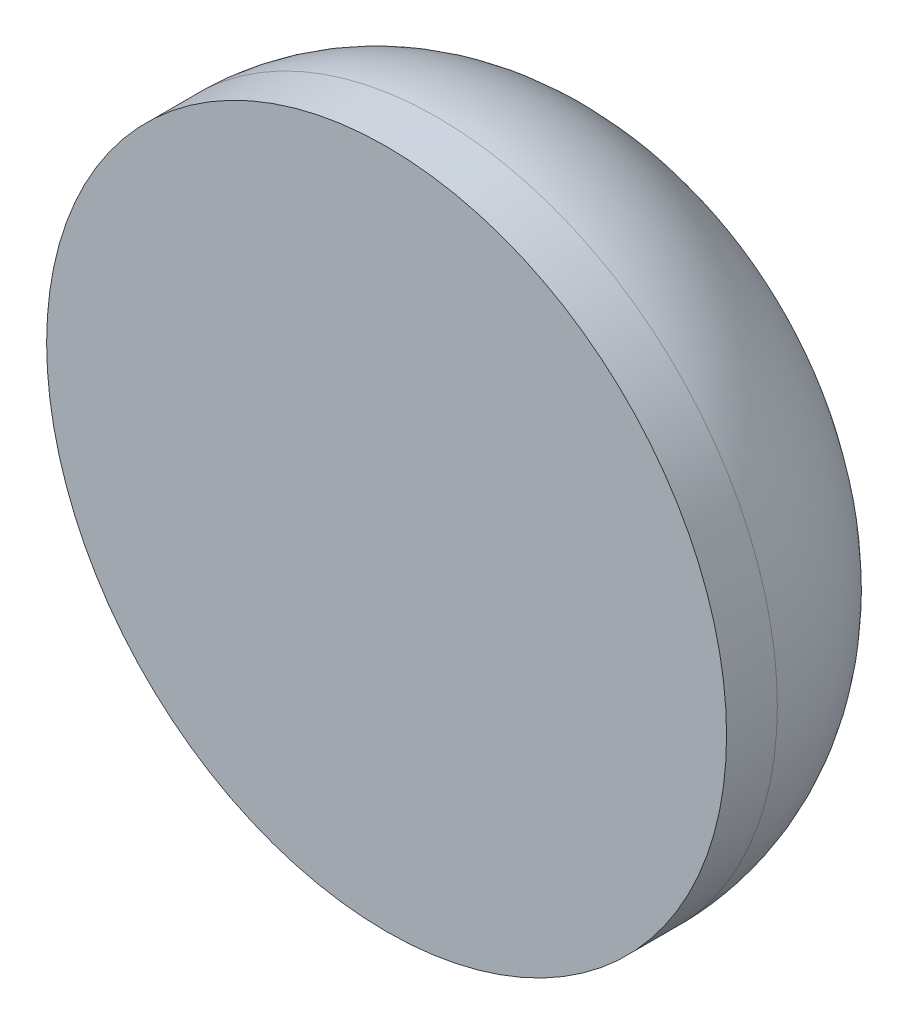
ISO-10303-21;
HEADER;
FILE_DESCRIPTION(('STEP AP214'),'2;1');
FILE_NAME('part.step','',(''),(''),'','','');
FILE_SCHEMA(('AUTOMOTIVE_DESIGN { 1 0 10303 214 1 1 1 1 }'));
ENDSEC;
DATA;
#1=APPLICATION_CONTEXT('core data for automotive mechanical design processes');
#2=APPLICATION_PROTOCOL_DEFINITION('international standard','automotive_design',2000,#1);
#3=PRODUCT_CONTEXT('',#1,'mechanical');
#4=PRODUCT('Part','Part','',(#3));
#5=PRODUCT_RELATED_PRODUCT_CATEGORY('part','',(#4));
#6=PRODUCT_DEFINITION_FORMATION('','',#4);
#7=PRODUCT_DEFINITION_CONTEXT('part definition',#1,'design');
#8=PRODUCT_DEFINITION('design','',#6,#7);
#9=PRODUCT_DEFINITION_SHAPE('','',#8);
#10=(LENGTH_UNIT() NAMED_UNIT(*) SI_UNIT(.MILLI.,.METRE.));
#11=(NAMED_UNIT(*) PLANE_ANGLE_UNIT() SI_UNIT($,.RADIAN.));
#12=(NAMED_UNIT(*) SI_UNIT($,.STERADIAN.) SOLID_ANGLE_UNIT());
#13=UNCERTAINTY_MEASURE_WITH_UNIT(LENGTH_MEASURE(1.E-05),#10,'distance_accuracy_value','');
#14=(GEOMETRIC_REPRESENTATION_CONTEXT(3) GLOBAL_UNCERTAINTY_ASSIGNED_CONTEXT((#13)) GLOBAL_UNIT_ASSIGNED_CONTEXT((#10,
#11,#12)) REPRESENTATION_CONTEXT('',''));
#15=CARTESIAN_POINT('',(0.,0.,0.));
#16=DIRECTION('',(0.,0.,1.));
#17=DIRECTION('',(1.,0.,0.));
#18=AXIS2_PLACEMENT_3D('',#15,#16,#17);
#19=CARTESIAN_POINT('',(199.5,42.5,-0.49999999999999));
#20=DIRECTION('',(0.,0.,1.));
#21=DIRECTION('',(1.,0.,0.));
#22=AXIS2_PLACEMENT_3D('',#19,#20,#21);
#23=DEGENERATE_TOROIDAL_SURFACE('',#22,1.35,2.,.T.);
#24=CARTESIAN_POINT('',(199.5,42.5,-0.49999999999999));
#25=DIRECTION('',(0.,0.,-1.));
#26=DIRECTION('',(1.,0.,0.));
#27=AXIS2_PLACEMENT_3D('',#24,#25,#26);
#28=CIRCLE('',#27,3.35);
#29=CARTESIAN_POINT('',(202.85,42.5,-0.49999999999999));
#30=VERTEX_POINT('',#29);
#31=EDGE_CURVE('E468',#30,#30,#28,.T.);
#32=ORIENTED_EDGE('',*,*,#31,.T.);
#33=EDGE_LOOP('',(#32));
#34=FACE_BOUND('',#33,.T.);
#35=CARTESIAN_POINT('',(200.175,41.330865704891,-2.49999999999999));
#36=DIRECTION('',(-0.884592557213002,-0.466364672464973,0.));
#37=VECTOR('',#36,1.);
#38=LINE('',#35,#37);
#39=CARTESIAN_POINT('',(200.175,41.330865704891,-2.5));
#40=VERTEX_POINT('',#39);
#41=CARTESIAN_POINT('',(200.083255290539,41.2824971186653,-2.5));
#42=VERTEX_POINT('',#41);
#43=EDGE_CURVE('E504',#40,#42,#38,.T.);
#44=ORIENTED_EDGE('',*,*,#43,.F.);
#45=CARTESIAN_POINT('',(200.262760779147,41.386134660834,-2.49999999999999));
#46=DIRECTION('',(-0.846179932388777,-0.532897290312612,0.));
#47=VECTOR('',#46,1.);
#48=LINE('',#45,#47);
#49=CARTESIAN_POINT('',(200.262760779147,41.3861346608342,-2.5));
#50=VERTEX_POINT('',#49);
#51=EDGE_CURVE('E503',#50,#40,#48,.T.);
#52=ORIENTED_EDGE('',*,*,#51,.F.);
#53=CARTESIAN_POINT('',(200.820888740771,41.7376259536584,-2.49231935264969));
#54=CARTESIAN_POINT('',(200.76707267624,41.7037343026438,-2.49491016210421));
#55=CARTESIAN_POINT('',(200.713237606234,41.6698306825838,-2.49659046781528));
#56=CARTESIAN_POINT('',(200.605554180877,41.6020150757748,-2.49880179554116));
#57=CARTESIAN_POINT('',(200.551705827366,41.5681030901846,-2.49933293118034));
#58=CARTESIAN_POINT('',(200.444017101078,41.5002841450182,-2.49991785013854));
#59=CARTESIAN_POINT('',(200.390176728197,41.4663771853756,-2.49997169719303));
#60=CARTESIAN_POINT('',(200.309413538374,41.4155150893058,-2.5000000783496));
#61=CARTESIAN_POINT('',(200.282490893817,41.3985600614404,-2.50000080608306));
#62=CARTESIAN_POINT('',(200.228645480391,41.3646499274227,-2.49999914897867));
#63=CARTESIAN_POINT('',(200.201722711523,41.3476948212705,-2.49999676412646));
#64=CARTESIAN_POINT('',(200.1748,41.3307397512327,-2.49999999997929));
#65=B_SPLINE_CURVE_WITH_KNOTS('',3,(#53,#54,#55,#56,#57,#58,#59,#60,#61,#62,#63,#64),
.UNSPECIFIED.,.F.,.F.,(4,2,2,2,2,4),(0.,0.190928170324365,0.381837461734963,0.57272125939935,
0.668171261887219,0.763621704639109),.UNSPECIFIED.);
#66=CARTESIAN_POINT('',(200.820688740771,41.7374999999995,-2.49232903908965));
#67=VERTEX_POINT('',#66);
#68=EDGE_CURVE('E450',#67,#50,#65,.T.);
#69=ORIENTED_EDGE('',*,*,#68,.F.);
#70=CARTESIAN_POINT('',(200.850007688199,42.5002,-2.49999999998515));
#71=CARTESIAN_POINT('',(200.84878563852,42.4684097287936,-2.49999676449696));
#72=CARTESIAN_POINT('',(200.847563586239,42.4366193899036,-2.49999914972349));
#73=CARTESIAN_POINT('',(200.845119487317,42.3730388588224,-2.50000080559944));
#74=CARTESIAN_POINT('',(200.843897440675,42.3412486666312,-2.50000007626321));
#75=CARTESIAN_POINT('',(200.840231516028,42.245883690263,-2.49997168433805));
#76=CARTESIAN_POINT('',(200.837787645843,42.1823091095479,-2.49991782215721));
#77=CARTESIAN_POINT('',(200.832899543358,42.0551505280727,-2.49933295920848));
#78=CARTESIAN_POINT('',(200.830455311053,41.991566527188,-2.49880189473561));
#79=CARTESIAN_POINT('',(200.825567449153,41.8644142042727,-2.49659099524004));
#80=CARTESIAN_POINT('',(200.823123819642,41.8008458844134,-2.49491104665122));
#81=CARTESIAN_POINT('',(200.820681052572,41.7373,-2.49232083712689));
#82=B_SPLINE_CURVE_WITH_KNOTS('',3,(#70,#71,#72,#73,#74,#75,#76,#77,#78,#79,#80,#81),
.UNSPECIFIED.,.F.,.F.,(4,2,2,2,2,4),(0.,0.0954413882068687,0.190882336452529,0.381748030871387,
0.572639209039685,0.763549259349352),.UNSPECIFIED.);
#83=CARTESIAN_POINT('',(200.846016069686,42.3963624578316,-2.5));
#84=VERTEX_POINT('',#83);
#85=EDGE_CURVE('E163',#84,#67,#82,.T.);
#86=ORIENTED_EDGE('',*,*,#85,.F.);
#87=CARTESIAN_POINT('',(200.85,42.5,-2.49999999999999));
#88=DIRECTION('',(-0.0384126248240564,-0.999261962777592,0.));
#89=VECTOR('',#88,1.);
#90=LINE('',#87,#89);
#91=CARTESIAN_POINT('',(200.85,42.5,-2.5));
#92=VERTEX_POINT('',#91);
#93=EDGE_CURVE('E159',#92,#84,#90,.T.);
#94=ORIENTED_EDGE('',*,*,#93,.F.);
#95=CARTESIAN_POINT('',(200.846016069686,42.6036375421684,-2.49999999999999));
#96=DIRECTION('',(0.0384126248243134,-0.999261962777582,0.));
#97=VECTOR('',#96,1.);
#98=LINE('',#95,#97);
#99=CARTESIAN_POINT('',(200.846016069686,42.6036375421685,-2.5));
#100=VERTEX_POINT('',#99);
#101=EDGE_CURVE('E457',#100,#92,#98,.T.);
#102=ORIENTED_EDGE('',*,*,#101,.F.);
#103=CARTESIAN_POINT('',(200.820681052572,43.2627,-2.49232083712688));
#104=CARTESIAN_POINT('',(200.823123819642,43.1991541155866,-2.49491104665121));
#105=CARTESIAN_POINT('',(200.825567449153,43.1355857957273,-2.49659099524003));
#106=CARTESIAN_POINT('',(200.830455311053,43.008433472812,-2.4988018947356));
#107=CARTESIAN_POINT('',(200.832899543358,42.9448494719273,-2.49933295920848));
#108=CARTESIAN_POINT('',(200.837787645843,42.8176908904521,-2.4999178221572));
#109=CARTESIAN_POINT('',(200.840231516028,42.754116309737,-2.49997168433805));
#110=CARTESIAN_POINT('',(200.843897440675,42.6587513333688,-2.50000007626321));
#111=CARTESIAN_POINT('',(200.845119487317,42.6269611411776,-2.50000080559944));
#112=CARTESIAN_POINT('',(200.847563586239,42.5633806100964,-2.49999914972349));
#113=CARTESIAN_POINT('',(200.84878563852,42.5315902712064,-2.49999676449696));
#114=CARTESIAN_POINT('',(200.850007688199,42.4998,-2.49999999998515));
#115=B_SPLINE_CURVE_WITH_KNOTS('',3,(#103,#104,#105,#106,#107,#108,#109,#110,#111,#112,#113,
#114),.UNSPECIFIED.,.F.,.F.,(4,2,2,2,2,4),(0.,0.19091005030967,0.381801228477975,
0.572666922896826,0.668107871142479,0.763549259349352),.UNSPECIFIED.);
#116=CARTESIAN_POINT('',(200.820688740771,43.2625,-2.49232903908966));
#117=VERTEX_POINT('',#116);
#118=EDGE_CURVE('E411',#117,#100,#115,.T.);
#119=ORIENTED_EDGE('',*,*,#118,.F.);
#120=CARTESIAN_POINT('',(200.1748,43.6692602487673,-2.49999999997929));
#121=CARTESIAN_POINT('',(200.201722711523,43.6523051787294,-2.49999676412646));
#122=CARTESIAN_POINT('',(200.228645480391,43.6353500725771,-2.49999914897867));
#123=CARTESIAN_POINT('',(200.282490893817,43.6014399385595,-2.50000080608306));
#124=CARTESIAN_POINT('',(200.309413538374,43.5844849106941,-2.5000000783496));
#125=CARTESIAN_POINT('',(200.390176728197,43.5336228146243,-2.49997169719303));
#126=CARTESIAN_POINT('',(200.444017101078,43.4997158549817,-2.49991785013854));
#127=CARTESIAN_POINT('',(200.551705827365,43.4318969098153,-2.49933293118034));
#128=CARTESIAN_POINT('',(200.605554180876,43.3979849242251,-2.49880179554117));
#129=CARTESIAN_POINT('',(200.713237606234,43.3301693174162,-2.49659046781529));
#130=CARTESIAN_POINT('',(200.76707267624,43.2962656973562,-2.49491016210422));
#131=CARTESIAN_POINT('',(200.820888740771,43.2623740463417,-2.49231935264969));
#132=B_SPLINE_CURVE_WITH_KNOTS('',3,(#120,#121,#122,#123,#124,#125,#126,#127,#128,#129,#130,
#131),.UNSPECIFIED.,.F.,.F.,(4,2,2,2,2,4),(0.,0.0954504427518806,0.190900445239734,
0.381784242904107,0.572693534314629,0.763621704639031),.UNSPECIFIED.);
#133=CARTESIAN_POINT('',(200.262760779147,43.6138653391659,-2.5));
#134=VERTEX_POINT('',#133);
#135=EDGE_CURVE('E392',#134,#117,#132,.T.);
#136=ORIENTED_EDGE('',*,*,#135,.F.);
#137=CARTESIAN_POINT('',(200.175,43.669134295109,-2.49999999999999));
#138=DIRECTION('',(0.846179932388867,-0.53289729031247,0.));
#139=VECTOR('',#138,1.);
#140=LINE('',#137,#139);
#141=CARTESIAN_POINT('',(200.175,43.669134295109,-2.5));
#142=VERTEX_POINT('',#141);
#143=EDGE_CURVE('E516',#142,#134,#140,.T.);
#144=ORIENTED_EDGE('',*,*,#143,.F.);
#145=CARTESIAN_POINT('',(200.083255290539,43.7175028813346,-2.49999999999999));
#146=DIRECTION('',(0.884592557212929,-0.466364672465111,0.));
#147=VECTOR('',#146,1.);
#148=LINE('',#145,#147);
#149=CARTESIAN_POINT('',(200.083255290539,43.7175028813346,-2.5));
#150=VERTEX_POINT('',#149);
#151=EDGE_CURVE('E399',#150,#142,#148,.T.);
#152=ORIENTED_EDGE('',*,*,#151,.F.);
#153=CARTESIAN_POINT('',(199.4998,44.0251054416904,-2.4923197734545));
#154=CARTESIAN_POINT('',(199.556057552404,43.9954459845914,-2.49491041284553));
#155=CARTESIAN_POINT('',(199.61233497096,43.9657760538893,-2.49659061732296));
#156=CARTESIAN_POINT('',(199.724903695106,43.9064288711235,-2.49880182365882));
#157=CARTESIAN_POINT('',(199.781194998773,43.8767516200737,-2.49933293912511));
#158=CARTESIAN_POINT('',(199.893769264145,43.8174015159266,-2.49991784220704));
#159=CARTESIAN_POINT('',(199.950052225961,43.7877286627712,-2.49997169354951));
#160=CARTESIAN_POINT('',(200.034479418325,43.7432179334045,-2.50000007775843));
#161=CARTESIAN_POINT('',(200.062623468691,43.7283801521868,-2.50000080594608));
#162=CARTESIAN_POINT('',(200.118911699351,43.6987045212521,-2.49999914918975));
#163=CARTESIAN_POINT('',(200.147055879645,43.683866671535,-2.49999676423142));
#164=CARTESIAN_POINT('',(200.1752,43.6690288534187,-2.49999999998105));
#165=B_SPLINE_CURVE_WITH_KNOTS('',3,(#153,#154,#155,#156,#157,#158,#159,#160,#161,#162,#163,
#164),.UNSPECIFIED.,.F.,.F.,(4,2,2,2,2,4),(0.,0.190923034094734,0.381827191195527,
0.572705857384065,0.668153293391491,0.763601169577052),.UNSPECIFIED.);
#166=CARTESIAN_POINT('',(199.5,44.025,-2.49232903908966));
#167=VERTEX_POINT('',#166);
#168=EDGE_CURVE('E353',#167,#150,#165,.T.);
#169=ORIENTED_EDGE('',*,*,#168,.F.);
#170=CARTESIAN_POINT('',(198.8248,43.6690288534187,-2.49999999998105));
#171=CARTESIAN_POINT('',(198.852944120355,43.6838666715351,-2.49999676423142));
#172=CARTESIAN_POINT('',(198.881088300649,43.6987045212521,-2.49999914918975));
#173=CARTESIAN_POINT('',(198.937376531309,43.7283801521869,-2.50000080594608));
#174=CARTESIAN_POINT('',(198.965520581675,43.7432179334045,-2.50000007775843));
#175=CARTESIAN_POINT('',(199.049947774039,43.7877286627712,-2.49997169354951));
#176=CARTESIAN_POINT('',(199.106230735855,43.8174015159266,-2.49991784220704));
#177=CARTESIAN_POINT('',(199.218805001227,43.8767516200737,-2.49933293912511));
#178=CARTESIAN_POINT('',(199.275096304894,43.9064288711235,-2.49880182365882));
#179=CARTESIAN_POINT('',(199.38766502904,43.9657760538893,-2.49659061732296));
#180=CARTESIAN_POINT('',(199.443942447596,43.9954459845914,-2.49491041284554));
#181=CARTESIAN_POINT('',(199.5002,44.0251054416904,-2.4923197734545));
#182=B_SPLINE_CURVE_WITH_KNOTS('',3,(#170,#171,#172,#173,#174,#175,#176,#177,#178,#179,#180,
#181),.UNSPECIFIED.,.F.,.F.,(4,2,2,2,2,4),(0.,0.0954478761855678,0.190895312192963,
0.381773978381528,0.572678135482325,0.763601169577052),.UNSPECIFIED.);
#183=CARTESIAN_POINT('',(198.916744709461,43.7175028813346,-2.5));
#184=VERTEX_POINT('',#183);
#185=EDGE_CURVE('E334',#184,#167,#182,.T.);
#186=ORIENTED_EDGE('',*,*,#185,.F.);
#187=CARTESIAN_POINT('',(198.825,43.669134295109,-2.49999999999999));
#188=DIRECTION('',(0.884592557212966,0.466364672465042,0.));
#189=VECTOR('',#188,1.);
#190=LINE('',#187,#189);
#191=CARTESIAN_POINT('',(198.825,43.669134295109,-2.5));
#192=VERTEX_POINT('',#191);
#193=EDGE_CURVE('E512',#192,#184,#190,.T.);
#194=ORIENTED_EDGE('',*,*,#193,.F.);
#195=CARTESIAN_POINT('',(198.737239220853,43.6138653391658,-2.49999999999999));
#196=DIRECTION('',(0.84617993238887,0.532897290312464,0.));
#197=VECTOR('',#196,1.);
#198=LINE('',#195,#197);
#199=CARTESIAN_POINT('',(198.737239220853,43.6138653391658,-2.5));
#200=VERTEX_POINT('',#199);
#201=EDGE_CURVE('E341',#200,#192,#198,.T.);
#202=ORIENTED_EDGE('',*,*,#201,.F.);
#203=CARTESIAN_POINT('',(198.179111259229,43.2623740463417,-2.49231935264969));
#204=CARTESIAN_POINT('',(198.23292732376,43.2962656973562,-2.49491016210423));
#205=CARTESIAN_POINT('',(198.286762393767,43.3301693174162,-2.4965904678153));
#206=CARTESIAN_POINT('',(198.394445819124,43.3979849242251,-2.49880179554118));
#207=CARTESIAN_POINT('',(198.448294172635,43.4318969098153,-2.49933293118035));
#208=CARTESIAN_POINT('',(198.555982898922,43.4997158549816,-2.49991785013854));
#209=CARTESIAN_POINT('',(198.609823271803,43.5336228146242,-2.49997169719303));
#210=CARTESIAN_POINT('',(198.690586461626,43.584484910694,-2.5000000783496));
#211=CARTESIAN_POINT('',(198.717509106183,43.6014399385594,-2.50000080608306));
#212=CARTESIAN_POINT('',(198.771354519609,43.635350072577,-2.49999914897867));
#213=CARTESIAN_POINT('',(198.798277288477,43.6523051787293,-2.49999676412646));
#214=CARTESIAN_POINT('',(198.8252,43.6692602487673,-2.49999999997929));
#215=B_SPLINE_CURVE_WITH_KNOTS('',3,(#203,#204,#205,#206,#207,#208,#209,#210,#211,#212,#213,
#214),.UNSPECIFIED.,.F.,.F.,(4,2,2,2,2,4),(0.,0.190928170324264,0.381837461734724,
0.572721259398997,0.668171261886762,0.763621704638635),.UNSPECIFIED.);
#216=CARTESIAN_POINT('',(198.179311259229,43.2625,-2.49232903908967));
#217=VERTEX_POINT('',#216);
#218=EDGE_CURVE('E295',#217,#200,#215,.T.);
#219=ORIENTED_EDGE('',*,*,#218,.F.);
#220=CARTESIAN_POINT('',(198.149992311801,42.4998,-2.49999999998515));
#221=CARTESIAN_POINT('',(198.15121436148,42.5315902712064,-2.49999676449696));
#222=CARTESIAN_POINT('',(198.152436413761,42.5633806100964,-2.49999914972349));
#223=CARTESIAN_POINT('',(198.154880512683,42.6269611411776,-2.50000080559944));
#224=CARTESIAN_POINT('',(198.156102559325,42.6587513333687,-2.50000007626321));
#225=CARTESIAN_POINT('',(198.159768483972,42.754116309737,-2.49997168433805));
#226=CARTESIAN_POINT('',(198.162212354157,42.817690890452,-2.49991782215721));
#227=CARTESIAN_POINT('',(198.167100456642,42.9448494719273,-2.49933295920848));
#228=CARTESIAN_POINT('',(198.169544688947,43.0084334728119,-2.49880189473561));
#229=CARTESIAN_POINT('',(198.174432550847,43.1355857957273,-2.49659099524004));
#230=CARTESIAN_POINT('',(198.176876180358,43.1991541155866,-2.49491104665122));
#231=CARTESIAN_POINT('',(198.179318947428,43.2627,-2.49232083712689));
#232=B_SPLINE_CURVE_WITH_KNOTS('',3,(#220,#221,#222,#223,#224,#225,#226,#227,#228,#229,#230,
#231),.UNSPECIFIED.,.F.,.F.,(4,2,2,2,2,4),(0.,0.0954413882068479,0.190882336452508,
0.381748030871373,0.572639209039678,0.763549259349353),.UNSPECIFIED.);
#233=CARTESIAN_POINT('',(198.153983930314,42.6036375421686,-2.5));
#234=VERTEX_POINT('',#233);
#235=EDGE_CURVE('E276',#234,#217,#232,.T.);
#236=ORIENTED_EDGE('',*,*,#235,.F.);
#237=CARTESIAN_POINT('',(198.15,42.5,-2.49999999999999));
#238=DIRECTION('',(0.0384126248240153,0.999261962777594,0.));
#239=VECTOR('',#238,1.);
#240=LINE('',#237,#239);
#241=CARTESIAN_POINT('',(198.15,42.5,-2.5));
#242=VERTEX_POINT('',#241);
#243=EDGE_CURVE('E508',#242,#234,#240,.T.);
#244=ORIENTED_EDGE('',*,*,#243,.F.);
#245=CARTESIAN_POINT('',(198.153983930314,42.3963624578315,-2.49999999999999));
#246=DIRECTION('',(-0.0384126248240564,0.999261962777592,0.));
#247=VECTOR('',#246,1.);
#248=LINE('',#245,#247);
#249=CARTESIAN_POINT('',(198.153983930314,42.3963624578316,-2.5));
#250=VERTEX_POINT('',#249);
#251=EDGE_CURVE('E283',#250,#242,#248,.T.);
#252=ORIENTED_EDGE('',*,*,#251,.F.);
#253=CARTESIAN_POINT('',(198.179318947428,41.7373,-2.49232083712688));
#254=CARTESIAN_POINT('',(198.176876180358,41.8008458844134,-2.49491104665123));
#255=CARTESIAN_POINT('',(198.174432550847,41.8644142042727,-2.49659099524005));
#256=CARTESIAN_POINT('',(198.169544688947,41.9915665271881,-2.49880189473562));
#257=CARTESIAN_POINT('',(198.167100456642,42.0551505280727,-2.49933295920849));
#258=CARTESIAN_POINT('',(198.162212354157,42.182309109548,-2.49991782215721));
#259=CARTESIAN_POINT('',(198.159768483973,42.245883690263,-2.49997168433805));
#260=CARTESIAN_POINT('',(198.156102559325,42.3412486666312,-2.50000007626322));
#261=CARTESIAN_POINT('',(198.154880512684,42.3730388588224,-2.50000080559944));
#262=CARTESIAN_POINT('',(198.152436413761,42.4366193899036,-2.49999914972349));
#263=CARTESIAN_POINT('',(198.15121436148,42.4684097287936,-2.49999676449696));
#264=CARTESIAN_POINT('',(198.149992311801,42.5002,-2.49999999998515));
#265=B_SPLINE_CURVE_WITH_KNOTS('',3,(#253,#254,#255,#256,#257,#258,#259,#260,#261,#262,#263,
#264),.UNSPECIFIED.,.F.,.F.,(4,2,2,2,2,4),(0.,0.190910050309672,0.38180122847797,
0.572666922896835,0.668107871142495,0.763549259349354),.UNSPECIFIED.);
#266=CARTESIAN_POINT('',(198.179311259229,41.7375,-2.49232903908967));
#267=VERTEX_POINT('',#266);
#268=EDGE_CURVE('E237',#267,#250,#265,.T.);
#269=ORIENTED_EDGE('',*,*,#268,.F.);
#270=CARTESIAN_POINT('',(198.8252,41.3307397512327,-2.49999999997929));
#271=CARTESIAN_POINT('',(198.798277288477,41.3476948212706,-2.49999676412646));
#272=CARTESIAN_POINT('',(198.771354519609,41.3646499274229,-2.49999914897867));
#273=CARTESIAN_POINT('',(198.717509106183,41.3985600614405,-2.50000080608306));
#274=CARTESIAN_POINT('',(198.690586461626,41.4155150893059,-2.5000000783496));
#275=CARTESIAN_POINT('',(198.609823271803,41.4663771853756,-2.49997169719303));
#276=CARTESIAN_POINT('',(198.555982898922,41.5002841450183,-2.49991785013854));
#277=CARTESIAN_POINT('',(198.448294172635,41.5681030901846,-2.49933293118034));
#278=CARTESIAN_POINT('',(198.394445819124,41.6020150757748,-2.49880179554117));
#279=CARTESIAN_POINT('',(198.286762393766,41.6698306825837,-2.4965904678153));
#280=CARTESIAN_POINT('',(198.23292732376,41.7037343026438,-2.49491016210422));
#281=CARTESIAN_POINT('',(198.179111259229,41.7376259536583,-2.49231935264969));
#282=B_SPLINE_CURVE_WITH_KNOTS('',3,(#270,#271,#272,#273,#274,#275,#276,#277,#278,#279,#280,
#281),.UNSPECIFIED.,.F.,.F.,(4,2,2,2,2,4),(0.,0.0954504427518312,0.190900445239631,
0.381784242903914,0.572693534314409,0.76362170463866),.UNSPECIFIED.);
#283=CARTESIAN_POINT('',(198.737239220854,41.3861346608338,-2.5));
#284=VERTEX_POINT('',#283);
#285=EDGE_CURVE('E216',#284,#267,#282,.T.);
#286=ORIENTED_EDGE('',*,*,#285,.F.);
#287=CARTESIAN_POINT('',(198.825,41.330865704891,-2.49999999999999));
#288=DIRECTION('',(-0.846179932388783,0.532897290312603,0.));
#289=VECTOR('',#288,1.);
#290=LINE('',#287,#289);
#291=CARTESIAN_POINT('',(198.825,41.330865704891,-2.5));
#292=VERTEX_POINT('',#291);
#293=EDGE_CURVE('E505',#292,#284,#290,.T.);
#294=ORIENTED_EDGE('',*,*,#293,.F.);
#295=CARTESIAN_POINT('',(198.916744709461,41.2824971186654,-2.49999999999999));
#296=DIRECTION('',(-0.884592557213015,0.466364672464948,0.));
#297=VECTOR('',#296,1.);
#298=LINE('',#295,#297);
#299=CARTESIAN_POINT('',(198.91674470946,41.2824971186656,-2.5));
#300=VERTEX_POINT('',#299);
#301=EDGE_CURVE('E225',#300,#292,#298,.T.);
#302=ORIENTED_EDGE('',*,*,#301,.F.);
#303=CARTESIAN_POINT('',(199.5002,40.9748945583097,-2.49231977345451));
#304=CARTESIAN_POINT('',(199.443942447596,41.0045540154087,-2.49491041284554));
#305=CARTESIAN_POINT('',(199.38766502904,41.0342239461107,-2.49659061732296));
#306=CARTESIAN_POINT('',(199.275096304893,41.0935711288765,-2.49880182365882));
#307=CARTESIAN_POINT('',(199.218805001227,41.1232483799263,-2.49933293912511));
#308=CARTESIAN_POINT('',(199.106230735854,41.1825984840733,-2.49991784220704));
#309=CARTESIAN_POINT('',(199.049947774039,41.2122713372288,-2.49997169354951));
#310=CARTESIAN_POINT('',(198.965520581675,41.2567820665954,-2.50000007775843));
#311=CARTESIAN_POINT('',(198.937376531309,41.2716198478131,-2.50000080594608));
#312=CARTESIAN_POINT('',(198.881088300649,41.3012954787478,-2.49999914918975));
#313=CARTESIAN_POINT('',(198.852944120355,41.3161333284649,-2.49999676423142));
#314=CARTESIAN_POINT('',(198.8248,41.3309711465814,-2.49999999998105));
#315=B_SPLINE_CURVE_WITH_KNOTS('',3,(#303,#304,#305,#306,#307,#308,#309,#310,#311,#312,#313,
#314),.UNSPECIFIED.,.F.,.F.,(4,2,2,2,2,4),(0.,0.190923034094707,0.381827191195508,
0.572705857384067,0.668153293391487,0.763601169577007),.UNSPECIFIED.);
#316=CARTESIAN_POINT('',(199.5,40.975,-2.49232903908968));
#317=VERTEX_POINT('',#316);
#318=EDGE_CURVE('E27',#317,#300,#315,.T.);
#319=ORIENTED_EDGE('',*,*,#318,.F.);
#320=CARTESIAN_POINT('',(200.1752,41.3309711465814,-2.49999999998105));
#321=CARTESIAN_POINT('',(200.147055879645,41.316133328465,-2.49999676423142));
#322=CARTESIAN_POINT('',(200.118911699351,41.301295478748,-2.49999914918975));
#323=CARTESIAN_POINT('',(200.062623468691,41.2716198478132,-2.50000080594608));
#324=CARTESIAN_POINT('',(200.034479418325,41.2567820665955,-2.50000007775843));
#325=CARTESIAN_POINT('',(199.950052225961,41.2122713372289,-2.49997169354951));
#326=CARTESIAN_POINT('',(199.893769264145,41.1825984840735,-2.49991784220704));
#327=CARTESIAN_POINT('',(199.781194998773,41.1232483799264,-2.49933293912511));
#328=CARTESIAN_POINT('',(199.724903695106,41.0935711288766,-2.49880182365883));
#329=CARTESIAN_POINT('',(199.61233497096,41.0342239461109,-2.49659061732297));
#330=CARTESIAN_POINT('',(199.556057552404,41.0045540154088,-2.49491041284554));
#331=CARTESIAN_POINT('',(199.4998,40.9748945583097,-2.49231977345451));
#332=B_SPLINE_CURVE_WITH_KNOTS('',3,(#320,#321,#322,#323,#324,#325,#326,#327,#328,#329,#330,
#331),.UNSPECIFIED.,.F.,.F.,(4,2,2,2,2,4),(0.,0.0954478761855613,0.19089531219295,
0.381773978381506,0.572678135482313,0.76360116957703),.UNSPECIFIED.);
#333=EDGE_CURVE('E11',#42,#317,#332,.T.);
#334=ORIENTED_EDGE('',*,*,#333,.F.);
#335=EDGE_LOOP('',(#44,#52,#69,#86,#94,#102,#119,#136,#144,#152,#169,#186,#194,#202,#219,#236,
#244,#252,#269,#286,#294,#302,#319,#334));
#336=FACE_BOUND('',#335,.T.);
#337=ADVANCED_FACE('F17',(#34,#336),#23,.T.);
#338=CARTESIAN_POINT('',(199.5,42.5,-2.5));
#339=DIRECTION('',(0.,0.,1.));
#340=DIRECTION('',(1.,0.,0.));
#341=AXIS2_PLACEMENT_3D('',#338,#339,#340);
#342=CYLINDRICAL_SURFACE('',#341,3.35);
#343=ORIENTED_EDGE('',*,*,#31,.F.);
#344=EDGE_LOOP('',(#343));
#345=FACE_BOUND('',#344,.T.);
#346=CARTESIAN_POINT('',(199.5,42.5,0.));
#347=DIRECTION('',(0.,0.,-1.));
#348=DIRECTION('',(-1.,0.,0.));
#349=AXIS2_PLACEMENT_3D('',#346,#347,#348);
#350=CIRCLE('',#349,3.35);
#351=CARTESIAN_POINT('',(196.15,42.5,0.));
#352=VERTEX_POINT('',#351);
#353=EDGE_CURVE('E202',#352,#352,#350,.T.);
#354=ORIENTED_EDGE('',*,*,#353,.T.);
#355=EDGE_LOOP('',(#354));
#356=FACE_BOUND('',#355,.T.);
#357=ADVANCED_FACE('F572',(#345,#356),#342,.T.);
#358=CARTESIAN_POINT('',(199.5,42.5,0.));
#359=DIRECTION('',(0.,0.,1.));
#360=DIRECTION('',(1.,0.,0.));
#361=AXIS2_PLACEMENT_3D('',#358,#359,#360);
#362=PLANE('',#361);
#363=ORIENTED_EDGE('',*,*,#353,.F.);
#364=EDGE_LOOP('',(#363));
#365=FACE_BOUND('',#364,.T.);
#366=ADVANCED_FACE('F577',(#365),#362,.T.);
#367=CARTESIAN_POINT('',(200.820688740771,41.7375,-0.49999999999999));
#368=DIRECTION('',(-0.532897290312599,0.846179932388786,0.));
#369=DIRECTION('',(-0.846179932388786,-0.532897290312599,0.));
#370=AXIS2_PLACEMENT_3D('',#367,#368,#369);
#371=PLANE('',#370);
#372=DIRECTION('',(0.,0.,-1.));
#373=VECTOR('',#372,1.);
#374=CARTESIAN_POINT('',(200.820688740771,41.7375,-0.49999999999999));
#375=LINE('',#374,#373);
#376=CARTESIAN_POINT('',(200.820688740771,41.7375,-0.49999999999999));
#377=VERTEX_POINT('',#376);
#378=EDGE_CURVE('E35',#377,#67,#375,.T.);
#379=ORIENTED_EDGE('',*,*,#378,.T.);
#380=ORIENTED_EDGE('',*,*,#68,.T.);
#381=ORIENTED_EDGE('',*,*,#51,.T.);
#382=DIRECTION('',(0.,0.,-1.));
#383=VECTOR('',#382,1.);
#384=CARTESIAN_POINT('',(200.175,41.330865704891,-0.49999999999999));
#385=LINE('',#384,#383);
#386=CARTESIAN_POINT('',(200.175,41.330865704891,-0.49999999999999));
#387=VERTEX_POINT('',#386);
#388=EDGE_CURVE('E157',#387,#40,#385,.T.);
#389=ORIENTED_EDGE('',*,*,#388,.F.);
#390=DIRECTION('',(-0.846179932388786,-0.532897290312599,0.));
#391=VECTOR('',#390,1.);
#392=CARTESIAN_POINT('',(200.820688740771,41.7375,-0.49999999999999));
#393=LINE('',#392,#391);
#394=EDGE_CURVE('E148',#377,#387,#393,.T.);
#395=ORIENTED_EDGE('',*,*,#394,.F.);
#396=EDGE_LOOP('',(#379,#380,#381,#389,#395));
#397=FACE_BOUND('',#396,.T.);
#398=ADVANCED_FACE('F155',(#397),#371,.T.);
#399=CARTESIAN_POINT('',(200.175,41.330865704891,-0.49999999999999));
#400=DIRECTION('',(-0.466364672464966,0.884592557213006,0.));
#401=DIRECTION('',(-0.884592557213006,-0.466364672464966,0.));
#402=AXIS2_PLACEMENT_3D('',#399,#400,#401);
#403=PLANE('',#402);
#404=ORIENTED_EDGE('',*,*,#43,.T.);
#405=ORIENTED_EDGE('',*,*,#333,.T.);
#406=DIRECTION('',(0.,0.,-1.));
#407=VECTOR('',#406,1.);
#408=CARTESIAN_POINT('',(199.5,40.975,-0.49999999999999));
#409=LINE('',#408,#407);
#410=CARTESIAN_POINT('',(199.5,40.975,-0.49999999999999));
#411=VERTEX_POINT('',#410);
#412=EDGE_CURVE('E43',#411,#317,#409,.T.);
#413=ORIENTED_EDGE('',*,*,#412,.F.);
#414=DIRECTION('',(-0.884592557213006,-0.466364672464966,0.));
#415=VECTOR('',#414,1.);
#416=CARTESIAN_POINT('',(200.175,41.330865704891,-0.49999999999999));
#417=LINE('',#416,#415);
#418=EDGE_CURVE('E158',#387,#411,#417,.T.);
#419=ORIENTED_EDGE('',*,*,#418,.F.);
#420=ORIENTED_EDGE('',*,*,#388,.T.);
#421=EDGE_LOOP('',(#404,#405,#413,#419,#420));
#422=FACE_BOUND('',#421,.T.);
#423=ADVANCED_FACE('F181',(#422),#403,.T.);
#424=CARTESIAN_POINT('',(199.5,40.975,-0.49999999999999));
#425=DIRECTION('',(0.466364672464939,0.88459255721302,0.));
#426=DIRECTION('',(-0.88459255721302,0.466364672464939,0.));
#427=AXIS2_PLACEMENT_3D('',#424,#425,#426);
#428=PLANE('',#427);
#429=ORIENTED_EDGE('',*,*,#412,.T.);
#430=ORIENTED_EDGE('',*,*,#318,.T.);
#431=ORIENTED_EDGE('',*,*,#301,.T.);
#432=DIRECTION('',(0.,0.,-1.));
#433=VECTOR('',#432,1.);
#434=CARTESIAN_POINT('',(198.825,41.330865704891,-0.49999999999999));
#435=LINE('',#434,#433);
#436=CARTESIAN_POINT('',(198.825,41.330865704891,-0.49999999999999));
#437=VERTEX_POINT('',#436);
#438=EDGE_CURVE('E537',#437,#292,#435,.T.);
#439=ORIENTED_EDGE('',*,*,#438,.F.);
#440=DIRECTION('',(-0.88459255721302,0.466364672464939,0.));
#441=VECTOR('',#440,1.);
#442=CARTESIAN_POINT('',(199.5,40.975,-0.49999999999999));
#443=LINE('',#442,#441);
#444=EDGE_CURVE('E555',#411,#437,#443,.T.);
#445=ORIENTED_EDGE('',*,*,#444,.F.);
#446=EDGE_LOOP('',(#429,#430,#431,#439,#445));
#447=FACE_BOUND('',#446,.T.);
#448=ADVANCED_FACE('F186',(#447),#428,.T.);
#449=CARTESIAN_POINT('',(198.825,41.330865704891,-0.49999999999999));
#450=DIRECTION('',(0.532897290312558,0.846179932388811,0.));
#451=DIRECTION('',(-0.846179932388811,0.532897290312558,0.));
#452=AXIS2_PLACEMENT_3D('',#449,#450,#451);
#453=PLANE('',#452);
#454=ORIENTED_EDGE('',*,*,#293,.T.);
#455=ORIENTED_EDGE('',*,*,#285,.T.);
#456=DIRECTION('',(0.,0.,-1.));
#457=VECTOR('',#456,1.);
#458=CARTESIAN_POINT('',(198.179311259229,41.7375,-0.49999999999999));
#459=LINE('',#458,#457);
#460=CARTESIAN_POINT('',(198.179311259229,41.7375,-0.49999999999999));
#461=VERTEX_POINT('',#460);
#462=EDGE_CURVE('E536',#461,#267,#459,.T.);
#463=ORIENTED_EDGE('',*,*,#462,.F.);
#464=DIRECTION('',(-0.846179932388811,0.532897290312558,0.));
#465=VECTOR('',#464,1.);
#466=CARTESIAN_POINT('',(198.825,41.330865704891,-0.49999999999999));
#467=LINE('',#466,#465);
#468=EDGE_CURVE('E552',#437,#461,#467,.T.);
#469=ORIENTED_EDGE('',*,*,#468,.F.);
#470=ORIENTED_EDGE('',*,*,#438,.T.);
#471=EDGE_LOOP('',(#454,#455,#463,#469,#470));
#472=FACE_BOUND('',#471,.T.);
#473=ADVANCED_FACE('F249',(#472),#453,.T.);
#474=CARTESIAN_POINT('',(198.179311259229,41.7375,-0.49999999999999));
#475=DIRECTION('',(0.99926196277759,0.0384126248241079,0.));
#476=DIRECTION('',(-0.0384126248241079,0.99926196277759,0.));
#477=AXIS2_PLACEMENT_3D('',#474,#475,#476);
#478=PLANE('',#477);
#479=ORIENTED_EDGE('',*,*,#462,.T.);
#480=ORIENTED_EDGE('',*,*,#268,.T.);
#481=ORIENTED_EDGE('',*,*,#251,.T.);
#482=DIRECTION('',(0.,0.,-1.));
#483=VECTOR('',#482,1.);
#484=CARTESIAN_POINT('',(198.15,42.5,-0.49999999999999));
#485=LINE('',#484,#483);
#486=CARTESIAN_POINT('',(198.15,42.5,-0.49999999999999));
#487=VERTEX_POINT('',#486);
#488=EDGE_CURVE('E535',#487,#242,#485,.T.);
#489=ORIENTED_EDGE('',*,*,#488,.F.);
#490=DIRECTION('',(-0.0384126248241079,0.99926196277759,0.));
#491=VECTOR('',#490,1.);
#492=CARTESIAN_POINT('',(198.179311259229,41.7375,-0.49999999999999));
#493=LINE('',#492,#491);
#494=EDGE_CURVE('E550',#461,#487,#493,.T.);
#495=ORIENTED_EDGE('',*,*,#494,.F.);
#496=EDGE_LOOP('',(#479,#480,#481,#489,#495));
#497=FACE_BOUND('',#496,.T.);
#498=ADVANCED_FACE('F253',(#497),#478,.T.);
#499=CARTESIAN_POINT('',(198.15,42.5,-0.49999999999999));
#500=DIRECTION('',(0.999261962777589,-0.0384126248241428,0.));
#501=DIRECTION('',(0.0384126248241428,0.999261962777589,0.));
#502=AXIS2_PLACEMENT_3D('',#499,#500,#501);
#503=PLANE('',#502);
#504=ORIENTED_EDGE('',*,*,#243,.T.);
#505=ORIENTED_EDGE('',*,*,#235,.T.);
#506=DIRECTION('',(0.,0.,-1.));
#507=VECTOR('',#506,1.);
#508=CARTESIAN_POINT('',(198.179311259229,43.2625,-0.49999999999999));
#509=LINE('',#508,#507);
#510=CARTESIAN_POINT('',(198.179311259229,43.2625,-0.49999999999999));
#511=VERTEX_POINT('',#510);
#512=EDGE_CURVE('E534',#511,#217,#509,.T.);
#513=ORIENTED_EDGE('',*,*,#512,.F.);
#514=DIRECTION('',(0.0384126248241428,0.999261962777589,0.));
#515=VECTOR('',#514,1.);
#516=CARTESIAN_POINT('',(198.15,42.5,-0.49999999999999));
#517=LINE('',#516,#515);
#518=EDGE_CURVE('E548',#487,#511,#517,.T.);
#519=ORIENTED_EDGE('',*,*,#518,.F.);
#520=ORIENTED_EDGE('',*,*,#488,.T.);
#521=EDGE_LOOP('',(#504,#505,#513,#519,#520));
#522=FACE_BOUND('',#521,.T.);
#523=ADVANCED_FACE('F307',(#522),#503,.T.);
#524=CARTESIAN_POINT('',(198.179311259229,43.2625,-0.49999999999999));
#525=DIRECTION('',(0.532897290312514,-0.846179932388839,0.));
#526=DIRECTION('',(0.846179932388839,0.532897290312514,0.));
#527=AXIS2_PLACEMENT_3D('',#524,#525,#526);
#528=PLANE('',#527);
#529=ORIENTED_EDGE('',*,*,#512,.T.);
#530=ORIENTED_EDGE('',*,*,#218,.T.);
#531=ORIENTED_EDGE('',*,*,#201,.T.);
#532=DIRECTION('',(0.,0.,-1.));
#533=VECTOR('',#532,1.);
#534=CARTESIAN_POINT('',(198.825,43.669134295109,-0.49999999999999));
#535=LINE('',#534,#533);
#536=CARTESIAN_POINT('',(198.825,43.669134295109,-0.49999999999999));
#537=VERTEX_POINT('',#536);
#538=EDGE_CURVE('E533',#537,#192,#535,.T.);
#539=ORIENTED_EDGE('',*,*,#538,.F.);
#540=DIRECTION('',(0.846179932388839,0.532897290312514,0.));
#541=VECTOR('',#540,1.);
#542=CARTESIAN_POINT('',(198.179311259229,43.2625,-0.49999999999999));
#543=LINE('',#542,#541);
#544=EDGE_CURVE('E561',#511,#537,#543,.T.);
#545=ORIENTED_EDGE('',*,*,#544,.F.);
#546=EDGE_LOOP('',(#529,#530,#531,#539,#545));
#547=FACE_BOUND('',#546,.T.);
#548=ADVANCED_FACE('F311',(#547),#528,.T.);
#549=CARTESIAN_POINT('',(198.825,43.669134295109,-0.49999999999999));
#550=DIRECTION('',(0.466364672465091,-0.88459255721294,0.));
#551=DIRECTION('',(0.88459255721294,0.466364672465091,0.));
#552=AXIS2_PLACEMENT_3D('',#549,#550,#551);
#553=PLANE('',#552);
#554=ORIENTED_EDGE('',*,*,#193,.T.);
#555=ORIENTED_EDGE('',*,*,#185,.T.);
#556=DIRECTION('',(0.,0.,-1.));
#557=VECTOR('',#556,1.);
#558=CARTESIAN_POINT('',(199.5,44.025,-0.49999999999999));
#559=LINE('',#558,#557);
#560=CARTESIAN_POINT('',(199.5,44.025,-0.49999999999999));
#561=VERTEX_POINT('',#560);
#562=EDGE_CURVE('E530',#561,#167,#559,.T.);
#563=ORIENTED_EDGE('',*,*,#562,.F.);
#564=DIRECTION('',(0.88459255721294,0.466364672465091,0.));
#565=VECTOR('',#564,1.);
#566=CARTESIAN_POINT('',(198.825,43.669134295109,-0.49999999999999));
#567=LINE('',#566,#565);
#568=EDGE_CURVE('E564',#537,#561,#567,.T.);
#569=ORIENTED_EDGE('',*,*,#568,.F.);
#570=ORIENTED_EDGE('',*,*,#538,.T.);
#571=EDGE_LOOP('',(#554,#555,#563,#569,#570));
#572=FACE_BOUND('',#571,.T.);
#573=ADVANCED_FACE('F365',(#572),#553,.T.);
#574=CARTESIAN_POINT('',(199.5,44.025,-0.49999999999999));
#575=DIRECTION('',(-0.466364672465088,-0.884592557212942,0.));
#576=DIRECTION('',(0.884592557212942,-0.466364672465088,0.));
#577=AXIS2_PLACEMENT_3D('',#574,#575,#576);
#578=PLANE('',#577);
#579=ORIENTED_EDGE('',*,*,#562,.T.);
#580=ORIENTED_EDGE('',*,*,#168,.T.);
#581=ORIENTED_EDGE('',*,*,#151,.T.);
#582=DIRECTION('',(0.,0.,-1.));
#583=VECTOR('',#582,1.);
#584=CARTESIAN_POINT('',(200.175,43.669134295109,-0.49999999999999));
#585=LINE('',#584,#583);
#586=CARTESIAN_POINT('',(200.175,43.669134295109,-0.49999999999999));
#587=VERTEX_POINT('',#586);
#588=EDGE_CURVE('E528',#587,#142,#585,.T.);
#589=ORIENTED_EDGE('',*,*,#588,.F.);
#590=DIRECTION('',(0.884592557212942,-0.466364672465088,0.));
#591=VECTOR('',#590,1.);
#592=CARTESIAN_POINT('',(199.5,44.025,-0.49999999999999));
#593=LINE('',#592,#591);
#594=EDGE_CURVE('E526',#561,#587,#593,.T.);
#595=ORIENTED_EDGE('',*,*,#594,.F.);
#596=EDGE_LOOP('',(#579,#580,#581,#589,#595));
#597=FACE_BOUND('',#596,.T.);
#598=ADVANCED_FACE('F369',(#597),#578,.T.);
#599=CARTESIAN_POINT('',(200.175,43.669134295109,-0.49999999999999));
#600=DIRECTION('',(-0.532897290312488,-0.846179932388856,0.));
#601=DIRECTION('',(0.846179932388856,-0.532897290312488,0.));
#602=AXIS2_PLACEMENT_3D('',#599,#600,#601);
#603=PLANE('',#602);
#604=ORIENTED_EDGE('',*,*,#143,.T.);
#605=ORIENTED_EDGE('',*,*,#135,.T.);
#606=DIRECTION('',(0.,0.,-1.));
#607=VECTOR('',#606,1.);
#608=CARTESIAN_POINT('',(200.820688740771,43.2625,-0.49999999999999));
#609=LINE('',#608,#607);
#610=CARTESIAN_POINT('',(200.820688740771,43.2625,-0.49999999999999));
#611=VERTEX_POINT('',#610);
#612=EDGE_CURVE('E167',#611,#117,#609,.T.);
#613=ORIENTED_EDGE('',*,*,#612,.F.);
#614=DIRECTION('',(0.846179932388856,-0.532897290312488,0.));
#615=VECTOR('',#614,1.);
#616=CARTESIAN_POINT('',(200.175,43.669134295109,-0.49999999999999));
#617=LINE('',#616,#615);
#618=EDGE_CURVE('E522',#587,#611,#617,.T.);
#619=ORIENTED_EDGE('',*,*,#618,.F.);
#620=ORIENTED_EDGE('',*,*,#588,.T.);
#621=EDGE_LOOP('',(#604,#605,#613,#619,#620));
#622=FACE_BOUND('',#621,.T.);
#623=ADVANCED_FACE('F423',(#622),#603,.T.);
#624=CARTESIAN_POINT('',(200.820688740771,43.2625,-0.49999999999999));
#625=DIRECTION('',(-0.999261962777589,-0.0384126248241323,0.));
#626=DIRECTION('',(0.0384126248241323,-0.99926196277759,0.));
#627=AXIS2_PLACEMENT_3D('',#624,#625,#626);
#628=PLANE('',#627);
#629=ORIENTED_EDGE('',*,*,#612,.T.);
#630=ORIENTED_EDGE('',*,*,#118,.T.);
#631=ORIENTED_EDGE('',*,*,#101,.T.);
#632=DIRECTION('',(0.,0.,-1.));
#633=VECTOR('',#632,1.);
#634=CARTESIAN_POINT('',(200.85,42.5,-0.49999999999999));
#635=LINE('',#634,#633);
#636=CARTESIAN_POINT('',(200.85,42.5,-0.49999999999999));
#637=VERTEX_POINT('',#636);
#638=EDGE_CURVE('E165',#637,#92,#635,.T.);
#639=ORIENTED_EDGE('',*,*,#638,.F.);
#640=DIRECTION('',(0.0384126248241323,-0.999261962777589,0.));
#641=VECTOR('',#640,1.);
#642=CARTESIAN_POINT('',(200.820688740771,43.2625,-0.49999999999999));
#643=LINE('',#642,#641);
#644=EDGE_CURVE('E151',#611,#637,#643,.T.);
#645=ORIENTED_EDGE('',*,*,#644,.F.);
#646=EDGE_LOOP('',(#629,#630,#631,#639,#645));
#647=FACE_BOUND('',#646,.T.);
#648=ADVANCED_FACE('F427',(#647),#628,.T.);
#649=CARTESIAN_POINT('',(200.85,42.5,-0.49999999999999));
#650=DIRECTION('',(-0.99926196277759,0.0384126248241288,0.));
#651=DIRECTION('',(-0.0384126248241288,-0.99926196277759,0.));
#652=AXIS2_PLACEMENT_3D('',#649,#650,#651);
#653=PLANE('',#652);
#654=ORIENTED_EDGE('',*,*,#93,.T.);
#655=ORIENTED_EDGE('',*,*,#85,.T.);
#656=ORIENTED_EDGE('',*,*,#378,.F.);
#657=DIRECTION('',(-0.0384126248241288,-0.999261962777589,0.));
#658=VECTOR('',#657,1.);
#659=CARTESIAN_POINT('',(200.85,42.5,-0.49999999999999));
#660=LINE('',#659,#658);
#661=EDGE_CURVE('E145',#637,#377,#660,.T.);
#662=ORIENTED_EDGE('',*,*,#661,.F.);
#663=ORIENTED_EDGE('',*,*,#638,.T.);
#664=EDGE_LOOP('',(#654,#655,#656,#662,#663));
#665=FACE_BOUND('',#664,.T.);
#666=ADVANCED_FACE('F161',(#665),#653,.T.);
#667=CARTESIAN_POINT('',(199.5,40.9057721081361,-0.49999999999999));
#668=DIRECTION('',(0.,0.,1.));
#669=DIRECTION('',(1.,0.,0.));
#670=AXIS2_PLACEMENT_3D('',#667,#668,#669);
#671=PLANE('',#670);
#672=ORIENTED_EDGE('',*,*,#394,.T.);
#673=ORIENTED_EDGE('',*,*,#418,.T.);
#674=ORIENTED_EDGE('',*,*,#444,.T.);
#675=ORIENTED_EDGE('',*,*,#468,.T.);
#676=ORIENTED_EDGE('',*,*,#494,.T.);
#677=ORIENTED_EDGE('',*,*,#518,.T.);
#678=ORIENTED_EDGE('',*,*,#544,.T.);
#679=ORIENTED_EDGE('',*,*,#568,.T.);
#680=ORIENTED_EDGE('',*,*,#594,.T.);
#681=ORIENTED_EDGE('',*,*,#618,.T.);
#682=ORIENTED_EDGE('',*,*,#644,.T.);
#683=ORIENTED_EDGE('',*,*,#661,.T.);
#684=EDGE_LOOP('',(#672,#673,#674,#675,#676,#677,#678,#679,#680,#681,#682,#683));
#685=FACE_BOUND('',#684,.T.);
#686=ADVANCED_FACE('F146',(#685),#671,.F.);
#687=CLOSED_SHELL('',(#337,#357,#366,#398,#423,#448,#473,#498,#523,#548,#573,#598,#623,#648,
#666,#686));
#688=MANIFOLD_SOLID_BREP('B1',#687);
#689=ADVANCED_BREP_SHAPE_REPRESENTATION('',(#18,#688),#14);
#690=SHAPE_DEFINITION_REPRESENTATION(#9,#689);
ENDSEC;
END-ISO-10303-21;
